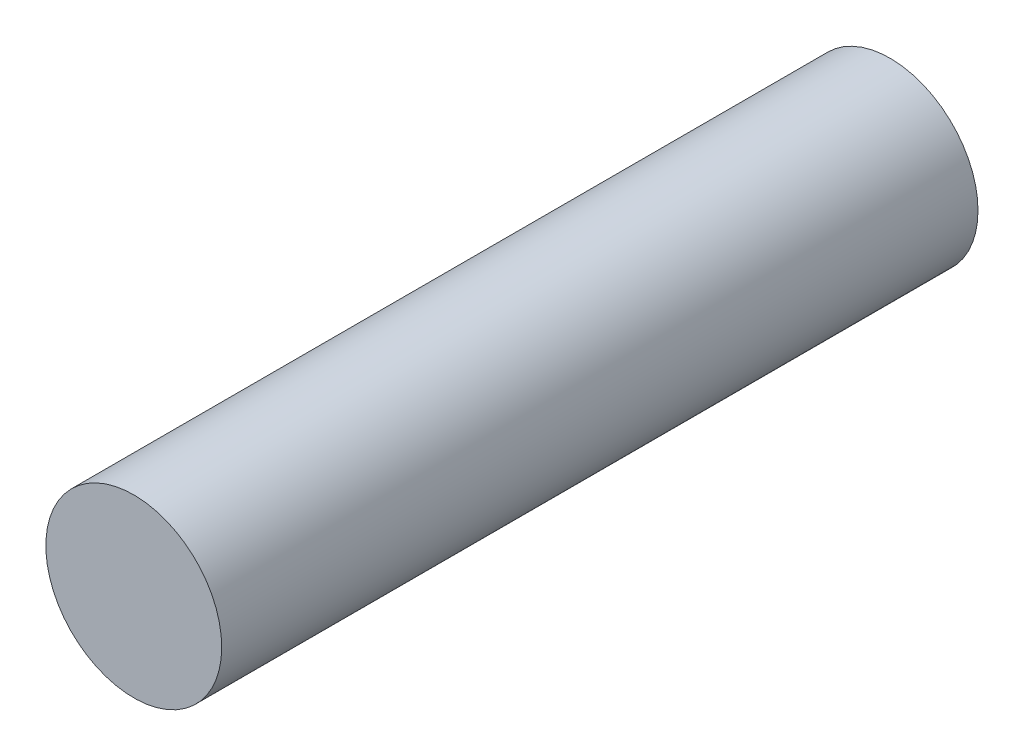
ISO-10303-21;
HEADER;
FILE_DESCRIPTION(('STEP AP214'),'2;1');
FILE_NAME('part.step','',(''),(''),'','','');
FILE_SCHEMA(('AUTOMOTIVE_DESIGN { 1 0 10303 214 1 1 1 1 }'));
ENDSEC;
DATA;
#1=APPLICATION_CONTEXT('core data for automotive mechanical design processes');
#2=APPLICATION_PROTOCOL_DEFINITION('international standard','automotive_design',2000,#1);
#3=PRODUCT_CONTEXT('',#1,'mechanical');
#4=PRODUCT('Part','Part','',(#3));
#5=PRODUCT_RELATED_PRODUCT_CATEGORY('part','',(#4));
#6=PRODUCT_DEFINITION_FORMATION('','',#4);
#7=PRODUCT_DEFINITION_CONTEXT('part definition',#1,'design');
#8=PRODUCT_DEFINITION('design','',#6,#7);
#9=PRODUCT_DEFINITION_SHAPE('','',#8);
#10=(LENGTH_UNIT() NAMED_UNIT(*) SI_UNIT(.MILLI.,.METRE.));
#11=(NAMED_UNIT(*) PLANE_ANGLE_UNIT() SI_UNIT($,.RADIAN.));
#12=(NAMED_UNIT(*) SI_UNIT($,.STERADIAN.) SOLID_ANGLE_UNIT());
#13=UNCERTAINTY_MEASURE_WITH_UNIT(LENGTH_MEASURE(1.E-05),#10,'distance_accuracy_value','');
#14=(GEOMETRIC_REPRESENTATION_CONTEXT(3) GLOBAL_UNCERTAINTY_ASSIGNED_CONTEXT((#13)) GLOBAL_UNIT_ASSIGNED_CONTEXT((#10,
#11,#12)) REPRESENTATION_CONTEXT('',''));
#15=CARTESIAN_POINT('',(0.,0.,0.));
#16=DIRECTION('',(0.,0.,1.));
#17=DIRECTION('',(1.,0.,0.));
#18=AXIS2_PLACEMENT_3D('',#15,#16,#17);
#19=CARTESIAN_POINT('',(0.,0.,43.));
#20=DIRECTION('',(0.,0.,-1.));
#21=DIRECTION('',(-1.,0.,0.));
#22=AXIS2_PLACEMENT_3D('',#19,#20,#21);
#23=CYLINDRICAL_SURFACE('',#22,5.);
#24=CARTESIAN_POINT('',(0.,0.,43.));
#25=DIRECTION('',(0.,0.,1.));
#26=DIRECTION('',(1.,0.,0.));
#27=AXIS2_PLACEMENT_3D('',#24,#25,#26);
#28=CIRCLE('',#27,5.);
#29=CARTESIAN_POINT('',(5.,0.,43.));
#30=VERTEX_POINT('',#29);
#31=EDGE_CURVE('E10',#30,#30,#28,.T.);
#32=ORIENTED_EDGE('',*,*,#31,.F.);
#33=EDGE_LOOP('',(#32));
#34=FACE_BOUND('',#33,.T.);
#35=CARTESIAN_POINT('',(0.,0.,0.));
#36=DIRECTION('',(0.,0.,1.));
#37=DIRECTION('',(1.,0.,0.));
#38=AXIS2_PLACEMENT_3D('',#35,#36,#37);
#39=CIRCLE('',#38,5.);
#40=CARTESIAN_POINT('',(5.,0.,0.));
#41=VERTEX_POINT('',#40);
#42=EDGE_CURVE('E40',#41,#41,#39,.T.);
#43=ORIENTED_EDGE('',*,*,#42,.T.);
#44=EDGE_LOOP('',(#43));
#45=FACE_BOUND('',#44,.T.);
#46=ADVANCED_FACE('F37',(#34,#45),#23,.T.);
#47=CARTESIAN_POINT('',(0.,0.,43.));
#48=DIRECTION('',(0.,0.,1.));
#49=DIRECTION('',(1.,0.,0.));
#50=AXIS2_PLACEMENT_3D('',#47,#48,#49);
#51=PLANE('',#50);
#52=ORIENTED_EDGE('',*,*,#31,.T.);
#53=EDGE_LOOP('',(#52));
#54=FACE_BOUND('',#53,.T.);
#55=ADVANCED_FACE('F52',(#54),#51,.T.);
#56=CARTESIAN_POINT('',(0.,0.,0.));
#57=DIRECTION('',(0.,0.,1.));
#58=DIRECTION('',(1.,0.,0.));
#59=AXIS2_PLACEMENT_3D('',#56,#57,#58);
#60=PLANE('',#59);
#61=ORIENTED_EDGE('',*,*,#42,.F.);
#62=EDGE_LOOP('',(#61));
#63=FACE_BOUND('',#62,.T.);
#64=ADVANCED_FACE('F50',(#63),#60,.F.);
#65=CLOSED_SHELL('',(#46,#55,#64));
#66=MANIFOLD_SOLID_BREP('B2',#65);
#67=ADVANCED_BREP_SHAPE_REPRESENTATION('',(#18,#66),#14);
#68=SHAPE_DEFINITION_REPRESENTATION(#9,#67);
ENDSEC;
END-ISO-10303-21;
